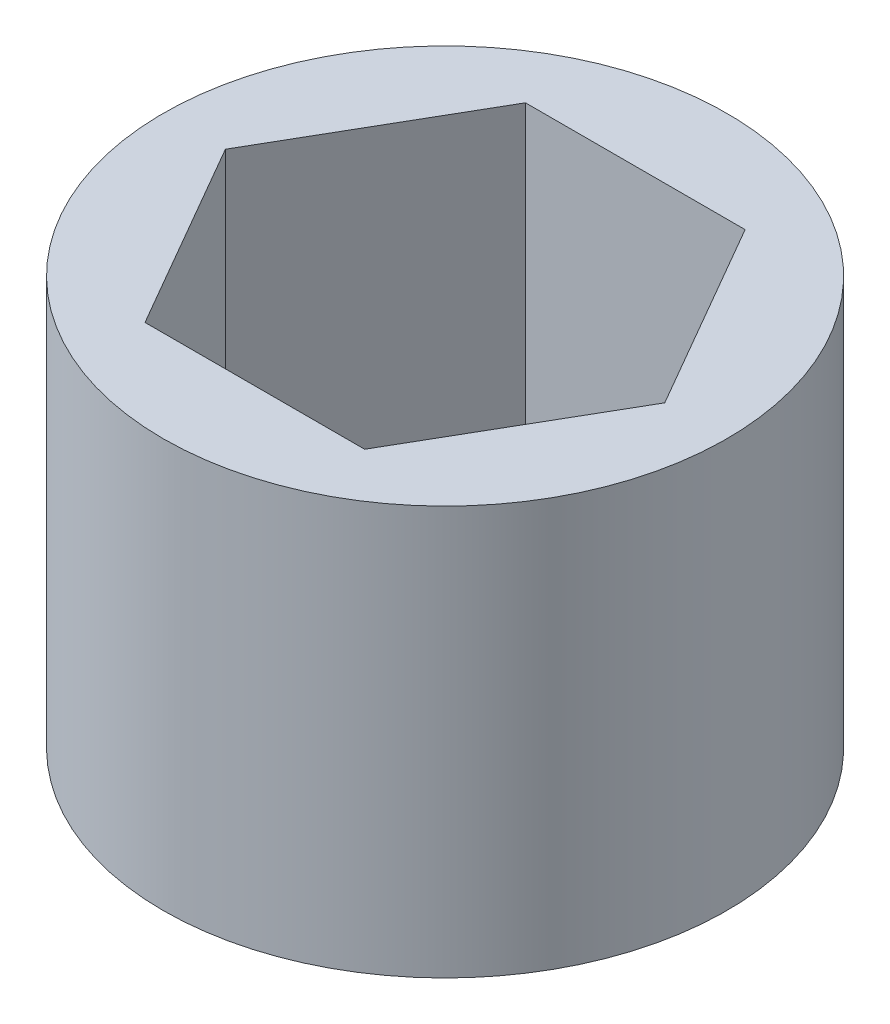
ISO-10303-21;
HEADER;
FILE_DESCRIPTION(('STEP AP214'),'2;1');
FILE_NAME('part.step','',(''),(''),'','','');
FILE_SCHEMA(('AUTOMOTIVE_DESIGN { 1 0 10303 214 1 1 1 1 }'));
ENDSEC;
DATA;
#1=APPLICATION_CONTEXT('core data for automotive mechanical design processes');
#2=APPLICATION_PROTOCOL_DEFINITION('international standard','automotive_design',2000,#1);
#3=PRODUCT_CONTEXT('',#1,'mechanical');
#4=PRODUCT('Part','Part','',(#3));
#5=PRODUCT_RELATED_PRODUCT_CATEGORY('part','',(#4));
#6=PRODUCT_DEFINITION_FORMATION('','',#4);
#7=PRODUCT_DEFINITION_CONTEXT('part definition',#1,'design');
#8=PRODUCT_DEFINITION('design','',#6,#7);
#9=PRODUCT_DEFINITION_SHAPE('','',#8);
#10=(LENGTH_UNIT() NAMED_UNIT(*) SI_UNIT(.MILLI.,.METRE.));
#11=(NAMED_UNIT(*) PLANE_ANGLE_UNIT() SI_UNIT($,.RADIAN.));
#12=(NAMED_UNIT(*) SI_UNIT($,.STERADIAN.) SOLID_ANGLE_UNIT());
#13=UNCERTAINTY_MEASURE_WITH_UNIT(LENGTH_MEASURE(1.E-05),#10,'distance_accuracy_value','');
#14=(GEOMETRIC_REPRESENTATION_CONTEXT(3) GLOBAL_UNCERTAINTY_ASSIGNED_CONTEXT((#13)) GLOBAL_UNIT_ASSIGNED_CONTEXT((#10,
#11,#12)) REPRESENTATION_CONTEXT('',''));
#15=CARTESIAN_POINT('',(0.,0.,0.));
#16=DIRECTION('',(0.,0.,1.));
#17=DIRECTION('',(1.,0.,0.));
#18=AXIS2_PLACEMENT_3D('',#15,#16,#17);
#19=CARTESIAN_POINT('',(0.,14.732,0.));
#20=DIRECTION('',(0.,1.,0.));
#21=DIRECTION('',(0.,0.,1.));
#22=AXIS2_PLACEMENT_3D('',#19,#20,#21);
#23=PLANE('',#22);
#24=CARTESIAN_POINT('',(0.,14.732,0.));
#25=DIRECTION('',(0.,1.,0.));
#26=DIRECTION('',(0.,0.,1.));
#27=AXIS2_PLACEMENT_3D('',#24,#25,#26);
#28=CIRCLE('',#27,10.16);
#29=CARTESIAN_POINT('',(0.,14.732,10.16));
#30=VERTEX_POINT('',#29);
#31=EDGE_CURVE('E11',#30,#30,#28,.T.);
#32=ORIENTED_EDGE('',*,*,#31,.T.);
#33=EDGE_LOOP('',(#32));
#34=FACE_BOUND('',#33,.T.);
#35=DIRECTION('',(-0.5,0.,-0.866025403784438));
#36=VECTOR('',#35,1.);
#37=CARTESIAN_POINT('',(7.9189362922049,14.732,0.));
#38=LINE('',#37,#36);
#39=CARTESIAN_POINT('',(7.9189362922049,14.732,0.));
#40=VERTEX_POINT('',#39);
#41=CARTESIAN_POINT('',(3.95946814610245,14.732,-6.858));
#42=VERTEX_POINT('',#41);
#43=EDGE_CURVE('E114',#40,#42,#38,.T.);
#44=ORIENTED_EDGE('',*,*,#43,.F.);
#45=DIRECTION('',(0.5,0.,-0.866025403784439));
#46=VECTOR('',#45,1.);
#47=CARTESIAN_POINT('',(3.95946814610245,14.732,6.858));
#48=LINE('',#47,#46);
#49=CARTESIAN_POINT('',(3.95946814610245,14.732,6.858));
#50=VERTEX_POINT('',#49);
#51=EDGE_CURVE('E105',#50,#40,#48,.T.);
#52=ORIENTED_EDGE('',*,*,#51,.F.);
#53=DIRECTION('',(1.,0.,0.));
#54=VECTOR('',#53,1.);
#55=CARTESIAN_POINT('',(-3.95946814610245,14.732,6.858));
#56=LINE('',#55,#54);
#57=CARTESIAN_POINT('',(-3.95946814610245,14.732,6.858));
#58=VERTEX_POINT('',#57);
#59=EDGE_CURVE('E139',#58,#50,#56,.T.);
#60=ORIENTED_EDGE('',*,*,#59,.F.);
#61=DIRECTION('',(0.5,0.,0.866025403784439));
#62=VECTOR('',#61,1.);
#63=CARTESIAN_POINT('',(-7.91893629220491,14.732,0.));
#64=LINE('',#63,#62);
#65=CARTESIAN_POINT('',(-7.91893629220491,14.732,0.));
#66=VERTEX_POINT('',#65);
#67=EDGE_CURVE('E136',#66,#58,#64,.T.);
#68=ORIENTED_EDGE('',*,*,#67,.F.);
#69=DIRECTION('',(-0.5,0.,0.866025403784439));
#70=VECTOR('',#69,1.);
#71=CARTESIAN_POINT('',(-3.95946814610245,14.732,-6.858));
#72=LINE('',#71,#70);
#73=CARTESIAN_POINT('',(-3.95946814610245,14.732,-6.858));
#74=VERTEX_POINT('',#73);
#75=EDGE_CURVE('E131',#74,#66,#72,.T.);
#76=ORIENTED_EDGE('',*,*,#75,.F.);
#77=DIRECTION('',(-1.,0.,0.));
#78=VECTOR('',#77,1.);
#79=CARTESIAN_POINT('',(3.95946814610245,14.732,-6.858));
#80=LINE('',#79,#78);
#81=EDGE_CURVE('E127',#42,#74,#80,.T.);
#82=ORIENTED_EDGE('',*,*,#81,.F.);
#83=EDGE_LOOP('',(#44,#52,#60,#68,#76,#82));
#84=FACE_BOUND('',#83,.T.);
#85=ADVANCED_FACE('F39',(#34,#84),#23,.T.);
#86=CARTESIAN_POINT('',(0.,0.,0.));
#87=DIRECTION('',(0.,1.,0.));
#88=DIRECTION('',(0.,0.,1.));
#89=AXIS2_PLACEMENT_3D('',#86,#87,#88);
#90=PLANE('',#89);
#91=CARTESIAN_POINT('',(0.,0.,0.));
#92=DIRECTION('',(0.,1.,0.));
#93=DIRECTION('',(0.,0.,1.));
#94=AXIS2_PLACEMENT_3D('',#91,#92,#93);
#95=CIRCLE('',#94,10.16);
#96=CARTESIAN_POINT('',(0.,0.,10.16));
#97=VERTEX_POINT('',#96);
#98=EDGE_CURVE('E43',#97,#97,#95,.T.);
#99=ORIENTED_EDGE('',*,*,#98,.F.);
#100=EDGE_LOOP('',(#99));
#101=FACE_BOUND('',#100,.T.);
#102=DIRECTION('',(0.5,0.,-0.866025403784439));
#103=VECTOR('',#102,1.);
#104=CARTESIAN_POINT('',(3.95946814610245,0.,6.858));
#105=LINE('',#104,#103);
#106=CARTESIAN_POINT('',(3.95946814610245,0.,6.858));
#107=VERTEX_POINT('',#106);
#108=CARTESIAN_POINT('',(7.9189362922049,0.,0.));
#109=VERTEX_POINT('',#108);
#110=EDGE_CURVE('E68',#107,#109,#105,.T.);
#111=ORIENTED_EDGE('',*,*,#110,.T.);
#112=DIRECTION('',(-0.5,0.,-0.866025403784438));
#113=VECTOR('',#112,1.);
#114=CARTESIAN_POINT('',(7.9189362922049,0.,0.));
#115=LINE('',#114,#113);
#116=CARTESIAN_POINT('',(3.95946814610245,0.,-6.858));
#117=VERTEX_POINT('',#116);
#118=EDGE_CURVE('E121',#109,#117,#115,.T.);
#119=ORIENTED_EDGE('',*,*,#118,.T.);
#120=DIRECTION('',(-1.,0.,0.));
#121=VECTOR('',#120,1.);
#122=CARTESIAN_POINT('',(3.95946814610245,0.,-6.858));
#123=LINE('',#122,#121);
#124=CARTESIAN_POINT('',(-3.95946814610245,0.,-6.858));
#125=VERTEX_POINT('',#124);
#126=EDGE_CURVE('E146',#117,#125,#123,.T.);
#127=ORIENTED_EDGE('',*,*,#126,.T.);
#128=DIRECTION('',(-0.5,0.,0.866025403784439));
#129=VECTOR('',#128,1.);
#130=CARTESIAN_POINT('',(-3.95946814610245,0.,-6.858));
#131=LINE('',#130,#129);
#132=CARTESIAN_POINT('',(-7.91893629220491,0.,0.));
#133=VERTEX_POINT('',#132);
#134=EDGE_CURVE('E150',#125,#133,#131,.T.);
#135=ORIENTED_EDGE('',*,*,#134,.T.);
#136=DIRECTION('',(0.5,0.,0.866025403784439));
#137=VECTOR('',#136,1.);
#138=CARTESIAN_POINT('',(-7.91893629220491,0.,0.));
#139=LINE('',#138,#137);
#140=CARTESIAN_POINT('',(-3.95946814610245,0.,6.858));
#141=VERTEX_POINT('',#140);
#142=EDGE_CURVE('E154',#133,#141,#139,.T.);
#143=ORIENTED_EDGE('',*,*,#142,.T.);
#144=DIRECTION('',(1.,0.,0.));
#145=VECTOR('',#144,1.);
#146=CARTESIAN_POINT('',(-3.95946814610245,0.,6.858));
#147=LINE('',#146,#145);
#148=EDGE_CURVE('E115',#141,#107,#147,.T.);
#149=ORIENTED_EDGE('',*,*,#148,.T.);
#150=EDGE_LOOP('',(#111,#119,#127,#135,#143,#149));
#151=FACE_BOUND('',#150,.T.);
#152=ADVANCED_FACE('F178',(#101,#151),#90,.F.);
#153=CARTESIAN_POINT('',(0.,14.732,0.));
#154=DIRECTION('',(0.,-1.,0.));
#155=DIRECTION('',(0.,0.,-1.));
#156=AXIS2_PLACEMENT_3D('',#153,#154,#155);
#157=CYLINDRICAL_SURFACE('',#156,10.16);
#158=ORIENTED_EDGE('',*,*,#31,.F.);
#159=EDGE_LOOP('',(#158));
#160=FACE_BOUND('',#159,.T.);
#161=ORIENTED_EDGE('',*,*,#98,.T.);
#162=EDGE_LOOP('',(#161));
#163=FACE_BOUND('',#162,.T.);
#164=ADVANCED_FACE('F41',(#160,#163),#157,.T.);
#165=CARTESIAN_POINT('',(3.95946814610245,14.732,6.858));
#166=DIRECTION('',(-0.866025403784439,0.,-0.5));
#167=DIRECTION('',(-0.5,0.,0.866025403784439));
#168=AXIS2_PLACEMENT_3D('',#165,#166,#167);
#169=PLANE('',#168);
#170=ORIENTED_EDGE('',*,*,#110,.F.);
#171=DIRECTION('',(0.,-1.,0.));
#172=VECTOR('',#171,1.);
#173=CARTESIAN_POINT('',(3.95946814610245,14.732,6.858));
#174=LINE('',#173,#172);
#175=EDGE_CURVE('E109',#50,#107,#174,.T.);
#176=ORIENTED_EDGE('',*,*,#175,.F.);
#177=ORIENTED_EDGE('',*,*,#51,.T.);
#178=DIRECTION('',(0.,-1.,0.));
#179=VECTOR('',#178,1.);
#180=CARTESIAN_POINT('',(7.9189362922049,14.732,0.));
#181=LINE('',#180,#179);
#182=EDGE_CURVE('E108',#40,#109,#181,.T.);
#183=ORIENTED_EDGE('',*,*,#182,.T.);
#184=EDGE_LOOP('',(#170,#176,#177,#183));
#185=FACE_BOUND('',#184,.T.);
#186=ADVANCED_FACE('F107',(#185),#169,.T.);
#187=CARTESIAN_POINT('',(7.9189362922049,14.732,0.));
#188=DIRECTION('',(-0.866025403784439,0.,0.5));
#189=DIRECTION('',(0.5,0.,0.866025403784439));
#190=AXIS2_PLACEMENT_3D('',#187,#188,#189);
#191=PLANE('',#190);
#192=ORIENTED_EDGE('',*,*,#118,.F.);
#193=ORIENTED_EDGE('',*,*,#182,.F.);
#194=ORIENTED_EDGE('',*,*,#43,.T.);
#195=DIRECTION('',(0.,-1.,0.));
#196=VECTOR('',#195,1.);
#197=CARTESIAN_POINT('',(3.95946814610245,14.732,-6.858));
#198=LINE('',#197,#196);
#199=EDGE_CURVE('E123',#42,#117,#198,.T.);
#200=ORIENTED_EDGE('',*,*,#199,.T.);
#201=EDGE_LOOP('',(#192,#193,#194,#200));
#202=FACE_BOUND('',#201,.T.);
#203=ADVANCED_FACE('F118',(#202),#191,.T.);
#204=CARTESIAN_POINT('',(3.95946814610245,14.732,-6.858));
#205=DIRECTION('',(0.,0.,1.));
#206=DIRECTION('',(1.,0.,0.));
#207=AXIS2_PLACEMENT_3D('',#204,#205,#206);
#208=PLANE('',#207);
#209=ORIENTED_EDGE('',*,*,#126,.F.);
#210=ORIENTED_EDGE('',*,*,#199,.F.);
#211=ORIENTED_EDGE('',*,*,#81,.T.);
#212=DIRECTION('',(0.,-1.,0.));
#213=VECTOR('',#212,1.);
#214=CARTESIAN_POINT('',(-3.95946814610245,14.732,-6.858));
#215=LINE('',#214,#213);
#216=EDGE_CURVE('E168',#74,#125,#215,.T.);
#217=ORIENTED_EDGE('',*,*,#216,.T.);
#218=EDGE_LOOP('',(#209,#210,#211,#217));
#219=FACE_BOUND('',#218,.T.);
#220=ADVANCED_FACE('F174',(#219),#208,.T.);
#221=CARTESIAN_POINT('',(-3.95946814610245,14.732,-6.858));
#222=DIRECTION('',(0.866025403784439,0.,0.5));
#223=DIRECTION('',(0.5,0.,-0.866025403784439));
#224=AXIS2_PLACEMENT_3D('',#221,#222,#223);
#225=PLANE('',#224);
#226=ORIENTED_EDGE('',*,*,#134,.F.);
#227=ORIENTED_EDGE('',*,*,#216,.F.);
#228=ORIENTED_EDGE('',*,*,#75,.T.);
#229=DIRECTION('',(0.,-1.,0.));
#230=VECTOR('',#229,1.);
#231=CARTESIAN_POINT('',(-7.91893629220491,14.732,0.));
#232=LINE('',#231,#230);
#233=EDGE_CURVE('E165',#66,#133,#232,.T.);
#234=ORIENTED_EDGE('',*,*,#233,.T.);
#235=EDGE_LOOP('',(#226,#227,#228,#234));
#236=FACE_BOUND('',#235,.T.);
#237=ADVANCED_FACE('F186',(#236),#225,.T.);
#238=CARTESIAN_POINT('',(-7.91893629220491,14.732,0.));
#239=DIRECTION('',(0.866025403784439,0.,-0.5));
#240=DIRECTION('',(-0.5,0.,-0.866025403784439));
#241=AXIS2_PLACEMENT_3D('',#238,#239,#240);
#242=PLANE('',#241);
#243=ORIENTED_EDGE('',*,*,#142,.F.);
#244=ORIENTED_EDGE('',*,*,#233,.F.);
#245=ORIENTED_EDGE('',*,*,#67,.T.);
#246=DIRECTION('',(0.,-1.,0.));
#247=VECTOR('',#246,1.);
#248=CARTESIAN_POINT('',(-3.95946814610245,14.732,6.858));
#249=LINE('',#248,#247);
#250=EDGE_CURVE('E58',#58,#141,#249,.T.);
#251=ORIENTED_EDGE('',*,*,#250,.T.);
#252=EDGE_LOOP('',(#243,#244,#245,#251));
#253=FACE_BOUND('',#252,.T.);
#254=ADVANCED_FACE('F184',(#253),#242,.T.);
#255=CARTESIAN_POINT('',(-3.95946814610245,14.732,6.858));
#256=DIRECTION('',(0.,0.,-1.));
#257=DIRECTION('',(-1.,0.,0.));
#258=AXIS2_PLACEMENT_3D('',#255,#256,#257);
#259=PLANE('',#258);
#260=ORIENTED_EDGE('',*,*,#148,.F.);
#261=ORIENTED_EDGE('',*,*,#250,.F.);
#262=ORIENTED_EDGE('',*,*,#59,.T.);
#263=ORIENTED_EDGE('',*,*,#175,.T.);
#264=EDGE_LOOP('',(#260,#261,#262,#263));
#265=FACE_BOUND('',#264,.T.);
#266=ADVANCED_FACE('F180',(#265),#259,.T.);
#267=CLOSED_SHELL('',(#85,#152,#164,#186,#203,#220,#237,#254,#266));
#268=MANIFOLD_SOLID_BREP('B2',#267);
#269=ADVANCED_BREP_SHAPE_REPRESENTATION('',(#18,#268),#14);
#270=SHAPE_DEFINITION_REPRESENTATION(#9,#269);
ENDSEC;
END-ISO-10303-21;
